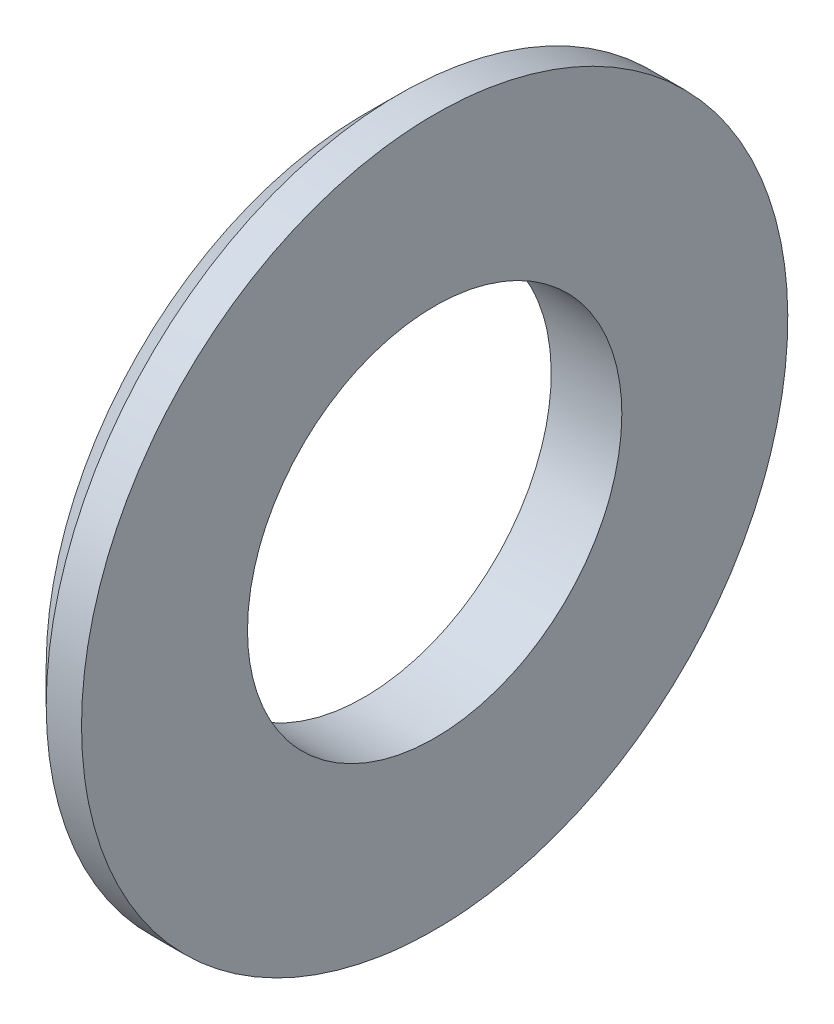
ISO-10303-21;
HEADER;
FILE_DESCRIPTION(('STEP AP214'),'2;1');
FILE_NAME('part.step','',(''),(''),'','','');
FILE_SCHEMA(('AUTOMOTIVE_DESIGN { 1 0 10303 214 1 1 1 1 }'));
ENDSEC;
DATA;
#1=APPLICATION_CONTEXT('core data for automotive mechanical design processes');
#2=APPLICATION_PROTOCOL_DEFINITION('international standard','automotive_design',2000,#1);
#3=PRODUCT_CONTEXT('',#1,'mechanical');
#4=PRODUCT('Part','Part','',(#3));
#5=PRODUCT_RELATED_PRODUCT_CATEGORY('part','',(#4));
#6=PRODUCT_DEFINITION_FORMATION('','',#4);
#7=PRODUCT_DEFINITION_CONTEXT('part definition',#1,'design');
#8=PRODUCT_DEFINITION('design','',#6,#7);
#9=PRODUCT_DEFINITION_SHAPE('','',#8);
#10=(LENGTH_UNIT() NAMED_UNIT(*) SI_UNIT(.MILLI.,.METRE.));
#11=(NAMED_UNIT(*) PLANE_ANGLE_UNIT() SI_UNIT($,.RADIAN.));
#12=(NAMED_UNIT(*) SI_UNIT($,.STERADIAN.) SOLID_ANGLE_UNIT());
#13=UNCERTAINTY_MEASURE_WITH_UNIT(LENGTH_MEASURE(1.E-05),#10,'distance_accuracy_value','');
#14=(GEOMETRIC_REPRESENTATION_CONTEXT(3) GLOBAL_UNCERTAINTY_ASSIGNED_CONTEXT((#13)) GLOBAL_UNIT_ASSIGNED_CONTEXT((#10,
#11,#12)) REPRESENTATION_CONTEXT('',''));
#15=CARTESIAN_POINT('',(0.,0.,0.));
#16=DIRECTION('',(0.,0.,1.));
#17=DIRECTION('',(1.,0.,0.));
#18=AXIS2_PLACEMENT_3D('',#15,#16,#17);
#19=CARTESIAN_POINT('',(0.,0.,4.5));
#20=CARTESIAN_POINT('',(0.5,0.,5.));
#21=(BOUNDED_CURVE() B_SPLINE_CURVE(1,(#19,#20),.UNSPECIFIED.,.F.,
.F.) B_SPLINE_CURVE_WITH_KNOTS((2,2),(0.,1.),
.UNSPECIFIED.) CURVE() GEOMETRIC_REPRESENTATION_ITEM() RATIONAL_B_SPLINE_CURVE((1.,1.)) REPRESENTATION_ITEM(''));
#22=CARTESIAN_POINT('',(-999.5,0.,0.));
#23=DIRECTION('',(1.,0.,0.));
#24=AXIS1_PLACEMENT('',#22,#23);
#25=SURFACE_OF_REVOLUTION('',#21,#24);
#26=CARTESIAN_POINT('',(0.499999999999945,0.,0.));
#27=DIRECTION('',(-1.,0.,0.));
#28=DIRECTION('',(0.,0.,1.));
#29=AXIS2_PLACEMENT_3D('',#26,#27,#28);
#30=CIRCLE('',#29,5.);
#31=CARTESIAN_POINT('',(0.5,0.,5.));
#32=VERTEX_POINT('',#31);
#33=EDGE_CURVE('E56',#32,#32,#30,.F.);
#34=ORIENTED_EDGE('',*,*,#33,.F.);
#35=EDGE_LOOP('',(#34));
#36=FACE_BOUND('',#35,.T.);
#37=CARTESIAN_POINT('',(0.,0.,0.));
#38=DIRECTION('',(-1.,0.,0.));
#39=DIRECTION('',(0.,0.,1.));
#40=AXIS2_PLACEMENT_3D('',#37,#38,#39);
#41=CIRCLE('',#40,4.5);
#42=CARTESIAN_POINT('',(0.,0.,4.5));
#43=VERTEX_POINT('',#42);
#44=EDGE_CURVE('E109',#43,#43,#41,.F.);
#45=ORIENTED_EDGE('',*,*,#44,.T.);
#46=EDGE_LOOP('',(#45));
#47=FACE_BOUND('',#46,.T.);
#48=ADVANCED_FACE('F51',(#36,#47),#25,.T.);
#49=CARTESIAN_POINT('',(0.5,0.,5.));
#50=CARTESIAN_POINT('',(1.,0.,5.));
#51=(BOUNDED_CURVE() B_SPLINE_CURVE(1,(#49,#50),.UNSPECIFIED.,.F.,
.F.) B_SPLINE_CURVE_WITH_KNOTS((2,2),(0.,1.),
.UNSPECIFIED.) CURVE() GEOMETRIC_REPRESENTATION_ITEM() RATIONAL_B_SPLINE_CURVE((1.,1.)) REPRESENTATION_ITEM(''));
#52=CARTESIAN_POINT('',(0.,0.,0.));
#53=DIRECTION('',(1.,0.,0.));
#54=AXIS1_PLACEMENT('',#52,#53);
#55=SURFACE_OF_REVOLUTION('',#51,#54);
#56=ORIENTED_EDGE('',*,*,#33,.T.);
#57=EDGE_LOOP('',(#56));
#58=FACE_BOUND('',#57,.T.);
#59=CARTESIAN_POINT('',(1.,-2.99308470301544E-10,5.));
#60=CARTESIAN_POINT('',(1.,-0.167758032825387,5.00000154802979));
#61=CARTESIAN_POINT('',(1.,-0.335493867137679,4.99155243066248));
#62=CARTESIAN_POINT('',(1.,-0.669391381789563,4.95782974268536));
#63=CARTESIAN_POINT('',(1.,-0.835552036829226,4.93254588724304));
#64=CARTESIAN_POINT('',(1.,-1.13764028737066,4.87088494986219));
#65=CARTESIAN_POINT('',(1.,-1.27408076216968,4.83698814317178));
#66=CARTESIAN_POINT('',(1.,-1.54367137821893,4.757816329775));
#67=CARTESIAN_POINT('',(1.,-1.6768205465427,4.71253800178656));
#68=CARTESIAN_POINT('',(1.,-1.93893765064654,4.61088908676401));
#69=CARTESIAN_POINT('',(1.,-2.06790209940762,4.554509512479));
#70=CARTESIAN_POINT('',(1.,-2.32066772389441,4.43105974651471));
#71=CARTESIAN_POINT('',(1.,-2.44446699179028,4.36398564800883));
#72=CARTESIAN_POINT('',(1.,-2.68587141401513,4.21969816808329));
#73=CARTESIAN_POINT('',(1.,-2.8034815327053,4.14249309197657));
#74=CARTESIAN_POINT('',(1.,-3.03182243680874,3.97841988539107));
#75=CARTESIAN_POINT('',(1.,-3.14255066966786,3.89154820242413));
#76=CARTESIAN_POINT('',(1.,-3.3562269830061,3.70883922378637));
#77=CARTESIAN_POINT('',(1.,-3.45917980361187,3.61300747151676));
#78=CARTESIAN_POINT('',(1.,-3.65668560110553,3.41297712458219));
#79=CARTESIAN_POINT('',(1.,-3.75123546389827,3.30877545507762));
#80=CARTESIAN_POINT('',(1.,-3.93119624315384,3.09280583925249));
#81=CARTESIAN_POINT('',(1.,-4.01660959363466,2.98103992110952));
#82=CARTESIAN_POINT('',(1.,-4.17774910369644,2.75066885920708));
#83=CARTESIAN_POINT('',(1.,-4.25347167455989,2.6320612052493));
#84=CARTESIAN_POINT('',(1.,-4.39463101299415,2.38892673620628));
#85=CARTESIAN_POINT('',(1.,-4.46007113790615,2.26440187052954));
#86=CARTESIAN_POINT('',(1.,-4.58025251774066,2.01023825538277));
#87=CARTESIAN_POINT('',(1.,-4.63498981087441,1.88059763351082));
#88=CARTESIAN_POINT('',(1.,-4.73332704440869,1.61720729374916));
#89=CARTESIAN_POINT('',(1.,-4.77693133245523,1.4834592028325));
#90=CARTESIAN_POINT('',(1.,-4.85273389831296,1.21275064904533));
#91=CARTESIAN_POINT('',(1.,-4.88492790115874,1.07578900263462));
#92=CARTESIAN_POINT('',(1.,-4.96397165042619,0.661663737250536));
#93=CARTESIAN_POINT('',(1.,-4.99339033045326,0.3809718040958));
#94=CARTESIAN_POINT('',(1.,-5.0046172843287,-0.181362849482049));
#95=CARTESIAN_POINT('',(1.,-4.98642551607755,-0.463005570745675));
#96=CARTESIAN_POINT('',(1.,-4.92397402324719,-0.879955886167007));
#97=CARTESIAN_POINT('',(1.,-4.89727235484689,-1.01809325324492));
#98=CARTESIAN_POINT('',(1.,-4.83233526183205,-1.29161141348033));
#99=CARTESIAN_POINT('',(1.,-4.79410415604719,-1.42699321861194));
#100=CARTESIAN_POINT('',(1.,-4.70635861941145,-1.69409746607234));
#101=CARTESIAN_POINT('',(1.,-4.65683986269291,-1.82581848367492));
#102=CARTESIAN_POINT('',(1.,-4.54690000061195,-2.08457440368558));
#103=CARTESIAN_POINT('',(1.,-4.48648292846403,-2.21161101880538));
#104=CARTESIAN_POINT('',(1.,-4.3551408650253,-2.46018614046577));
#105=CARTESIAN_POINT('',(1.,-4.28421226799065,-2.58172274160106));
#106=CARTESIAN_POINT('',(1.,-4.13239508063002,-2.81834399335951));
#107=CARTESIAN_POINT('',(1.,-4.05151017620756,-2.93343100884458));
#108=CARTESIAN_POINT('',(1.,-3.88030813089111,-3.15641778608208));
#109=CARTESIAN_POINT('',(1.,-3.78998809884217,-3.26431532811692));
#110=CARTESIAN_POINT('',(1.,-3.60061365020971,-3.47207879556547));
#111=CARTESIAN_POINT('',(1.,-3.50156246857072,-3.5719476696458));
#112=CARTESIAN_POINT('',(1.,-3.29534749765881,-3.7630380096989));
#113=CARTESIAN_POINT('',(1.,-3.18817953217534,-3.85425496901711));
#114=CARTESIAN_POINT('',(1.,-2.96657943962917,-4.0273021107453));
#115=CARTESIAN_POINT('',(1.,-2.85215000368759,-4.10913573944699));
#116=CARTESIAN_POINT('',(1.,-2.61672970089746,-4.26292223838351));
#117=CARTESIAN_POINT('',(1.,-2.49573472080214,-4.33486881242074));
#118=CARTESIAN_POINT('',(1.,-2.24815726096902,-4.46828339954117));
#119=CARTESIAN_POINT('',(1.,-2.12157682148357,-4.52975519959861));
#120=CARTESIAN_POINT('',(1.,-1.86373373364054,-4.6417931857738));
#121=CARTESIAN_POINT('',(1.,-1.73247296804808,-4.6923637007616));
#122=CARTESIAN_POINT('',(1.,-1.46620299991553,-4.78225882727186));
#123=CARTESIAN_POINT('',(1.,-1.33119460262864,-4.82158583447658));
#124=CARTESIAN_POINT('',(1.,-0.999436570010491,-4.90321814181991));
#125=CARTESIAN_POINT('',(1.,-0.801170962497733,-4.93949305866675));
#126=CARTESIAN_POINT('',(1.,-0.401924384471656,-4.98787122446463));
#127=CARTESIAN_POINT('',(1.,-0.200946267854761,-4.99999814565042));
#128=CARTESIAN_POINT('',(1.,0.167758031158162,-5.00000154808568));
#129=CARTESIAN_POINT('',(1.,0.335493865473081,-4.99155243077434));
#130=CARTESIAN_POINT('',(1.,0.669391380136326,-4.95782974290861));
#131=CARTESIAN_POINT('',(1.,0.835552035184721,-4.93254588752163));
#132=CARTESIAN_POINT('',(1.,1.13764028574709,-4.87088495024139));
#133=CARTESIAN_POINT('',(1.,1.27408076055748,-4.83698814359644));
#134=CARTESIAN_POINT('',(1.,1.54367137663327,-4.75781633028947));
#135=CARTESIAN_POINT('',(1.,1.6768205449722,-4.71253800234538));
#136=CARTESIAN_POINT('',(1.,1.93893764910992,-4.61088908741017));
#137=CARTESIAN_POINT('',(1.,2.06790209788972,-4.55450951316818));
#138=CARTESIAN_POINT('',(1.,2.32066772241753,-4.4310597472882));
#139=CARTESIAN_POINT('',(1.,2.44446699033568,-4.36398564882361));
#140=CARTESIAN_POINT('',(1.,2.68587141260856,-4.21969816897859));
#141=CARTESIAN_POINT('',(1.,2.80348153132445,-4.14249309291108));
#142=CARTESIAN_POINT('',(1.,3.03182243548256,-3.9784198864017));
#143=CARTESIAN_POINT('',(1.,3.14255066837063,-3.89154820347168));
#144=CARTESIAN_POINT('',(1.,3.35622698176978,-3.70883922490516));
#145=CARTESIAN_POINT('',(1.,3.4591798024075,-3.61300747266985));
#146=CARTESIAN_POINT('',(1.,3.65668559996786,-3.4129771258011));
#147=CARTESIAN_POINT('',(1.,3.75123546279534,-3.30877545632804));
#148=CARTESIAN_POINT('',(1.,3.9311962421229,-3.09280584056289));
#149=CARTESIAN_POINT('',(1.,4.01660959264098,-2.98103992244839));
#150=CARTESIAN_POINT('',(1.,4.17774910277955,-2.75066886059966));
#151=CARTESIAN_POINT('',(1.,4.25347167368253,-2.63206120666712));
#152=CARTESIAN_POINT('',(1.,4.39463101219784,-2.38892673767115));
#153=CARTESIAN_POINT('',(1.,4.46007113715135,-2.26440187201623));
#154=CARTESIAN_POINT('',(1.,4.58025251707059,-2.01023825690951));
#155=CARTESIAN_POINT('',(1.,4.63498981024755,-1.88059763505582));
#156=CARTESIAN_POINT('',(1.,4.73332704386962,-1.61720729532694));
#157=CARTESIAN_POINT('',(1.,4.77693133196075,-1.4834592044248));
#158=CARTESIAN_POINT('',(1.,4.85273389790871,-1.21275065066291));
#159=CARTESIAN_POINT('',(1.,4.88492790080015,-1.07578900426292));
#160=CARTESIAN_POINT('',(1.,4.96397165020563,-0.661663738905188));
#161=CARTESIAN_POINT('',(1.,4.99339033032627,-0.380971805760261));
#162=CARTESIAN_POINT('',(1.,5.00461728438915,0.181362847813846));
#163=CARTESIAN_POINT('',(1.,4.98642551623189,0.463005569083539));
#164=CARTESIAN_POINT('',(1.,4.92397402354051,0.879955884525689));
#165=CARTESIAN_POINT('',(1.,4.89727235518625,1.0180932516125));
#166=CARTESIAN_POINT('',(1.,4.83233526226259,1.29161141186956));
#167=CARTESIAN_POINT('',(1.,4.79410415652286,1.42699321701391));
#168=CARTESIAN_POINT('',(1.,4.70635861997615,1.69409746450354));
#169=CARTESIAN_POINT('',(1.,4.65683986330153,1.82581848212261));
#170=CARTESIAN_POINT('',(1.,4.54690000130683,2.08457440216988));
#171=CARTESIAN_POINT('',(1.,4.48648292920127,2.21161101730981));
#172=CARTESIAN_POINT('',(1.,4.3551408658454,2.46018613901399));
#173=CARTESIAN_POINT('',(1.,4.28421226885126,2.58172274017293));
#174=CARTESIAN_POINT('',(1.,4.13239508156949,2.81834399198202));
#175=CARTESIAN_POINT('',(1.,4.05151017718538,2.93343100749406));
#176=CARTESIAN_POINT('',(1.,3.88030813194319,3.15641778478873));
#177=CARTESIAN_POINT('',(1.,3.78998809993015,3.26431532685374));
#178=CARTESIAN_POINT('',(1.,3.6006136513668,3.47207879436556));
#179=CARTESIAN_POINT('',(1.,3.50156246976101,3.57194766847896));
#180=CARTESIAN_POINT('',(1.,3.29534749891278,3.76303800860077));
#181=CARTESIAN_POINT('',(1.,3.18817953345978,3.85425496795464));
#182=CARTESIAN_POINT('',(1.,2.96657944097144,4.02730210975656));
#183=CARTESIAN_POINT('',(1.,2.85215000505722,4.10913573849633));
#184=CARTESIAN_POINT('',(1.,2.61672970231883,4.26292223751101));
#185=CARTESIAN_POINT('',(1.,2.4957347222479,4.33486881158835));
#186=CARTESIAN_POINT('',(1.,2.24815726246011,4.46828339879093));
#187=CARTESIAN_POINT('',(1.,2.12157682299561,4.52975519889042));
#188=CARTESIAN_POINT('',(1.,1.86373373519004,4.64179318515166));
#189=CARTESIAN_POINT('',(1.,1.73247296961409,4.69236370018341));
#190=CARTESIAN_POINT('',(1.,1.46620300151073,4.78225882678281));
#191=CARTESIAN_POINT('',(1.,1.33119460423653,4.8215858340327));
#192=CARTESIAN_POINT('',(1.,0.999436571105496,4.90321814161946));
#193=CARTESIAN_POINT('',(1.,0.801170963048538,4.93949305860007));
#194=CARTESIAN_POINT('',(1.,0.401924383918908,4.98787122453155));
#195=CARTESIAN_POINT('',(1.,0.200946266742681,4.99999814571736));
#196=CARTESIAN_POINT('',(1.,-2.99308470301544E-10,5.));
#197=B_SPLINE_CURVE_WITH_KNOTS('',3,(#59,#60,#61,#62,#63,#64,#65,#66,#67,#68,#69,#70,#71,#72,
#73,#74,#75,#76,#77,#78,#79,#80,#81,#82,#83,#84,#85,#86,#87,#88,#89,#90,#91,#92,#93,#94,#95,#96,
#97,#98,#99,#100,#101,#102,#103,#104,#105,#106,#107,#108,#109,#110,#111,#112,#113,#114,#115,
#116,#117,#118,#119,#120,#121,#122,#123,#124,#125,#126,#127,#128,#129,#130,#131,#132,#133,#134,
#135,#136,#137,#138,#139,#140,#141,#142,#143,#144,#145,#146,#147,#148,#149,#150,#151,#152,#153,
#154,#155,#156,#157,#158,#159,#160,#161,#162,#163,#164,#165,#166,#167,#168,#169,#170,#171,#172,
#173,#174,#175,#176,#177,#178,#179,#180,#181,#182,#183,#184,#185,#186,#187,#188,#189,#190,#191,
#192,#193,#194,#195,#196),.UNSPECIFIED.,.T.,.F.,(4,2,2,2,2,2,2,2,2,2,2,2,2,2,2,2,2,2,2,2,2,2,2,
2,2,2,2,2,2,2,2,2,2,2,2,2,2,2,2,2,2,2,2,2,2,2,2,2,2,2,2,2,2,2,2,2,2,2,2,2,2,2,2,2,2,2,2,2,4),
(0.,0.503028424610895,1.00636444627927,1.42764855986454,1.84905575286752,2.27080551824605,
2.69270970791953,3.11427015909089,3.53598604904621,3.95744273747951,4.37905497001639,
4.8005546014842,5.22220987499996,5.64372718566218,6.06540023213516,6.48690835468098,
6.90857423249018,7.75099585816318,8.59341822874699,9.01508373374531,9.43659148219846,
9.85826104124517,10.2797748691019,10.7014336239815,11.1229367443177,11.544569404554,
11.9660464986957,12.3877419420515,12.8092820064289,13.2310892809016,13.6527437331661,
14.0742304379128,14.4956272683898,15.0987633372328,15.7013078612753,16.2043362858851,
16.7076723075545,17.12895642114,17.5503636141432,17.9721133795215,18.3940175691948,
18.8155780203661,19.2372939103214,19.6587505987547,20.0803628312917,20.5018624627595,
20.9235177362752,21.3450350469374,21.7667080934104,22.1882162159562,22.6098820937655,
23.4523037194384,24.2947260900223,24.7163915950206,25.1378993434737,25.5595689025204,
25.981082730377,26.4027414852567,26.8242446055929,27.2458772658296,27.6673543599716,
28.089049803327,28.5105898677042,28.9323971421754,29.3540515944386,29.7755382991864,
30.1969351296651,30.8000712001731,31.4026157258778),.UNSPECIFIED.);
#198=CARTESIAN_POINT('',(1.,-2.99308470301544E-10,5.));
#199=VERTEX_POINT('',#198);
#200=EDGE_CURVE('E65',#199,#199,#197,.T.);
#201=ORIENTED_EDGE('',*,*,#200,.F.);
#202=EDGE_LOOP('',(#201));
#203=FACE_BOUND('',#202,.T.);
#204=ADVANCED_FACE('F86',(#58,#203),#55,.T.);
#205=CARTESIAN_POINT('',(0.,-4.554,4.554));
#206=DIRECTION('',(-1.,0.,0.));
#207=DIRECTION('',(0.,0.,-1.));
#208=AXIS2_PLACEMENT_3D('',#205,#206,#207);
#209=PLANE('',#208);
#210=CARTESIAN_POINT('',(0.,-1.58633489259819E-10,2.65));
#211=CARTESIAN_POINT('',(0.,-0.0744036897546171,2.64999955411855));
#212=CARTESIAN_POINT('',(0.,-0.148821053038145,2.64686366502387));
#213=CARTESIAN_POINT('',(0.,-0.297141510098404,2.63434049635336));
#214=CARTESIAN_POINT('',(0.,-0.371044445535923,2.62495137117123));
#215=CARTESIAN_POINT('',(0.,-0.517921052661863,2.59996397233258));
#216=CARTESIAN_POINT('',(0.,-0.590893058572626,2.58435584236101));
#217=CARTESIAN_POINT('',(0.,-0.735303386108935,2.54703802343968));
#218=CARTESIAN_POINT('',(0.,-0.806740412289601,2.5253233830353));
#219=CARTESIAN_POINT('',(0.,-1.01767791920745,2.45131991290642));
#220=CARTESIAN_POINT('',(0.,-1.15415981832655,2.39011074898915));
#221=CARTESIAN_POINT('',(0.,-1.41489510667138,2.24561538532905));
#222=CARTESIAN_POINT('',(0.,-1.53914803079326,2.16232834634437));
#223=CARTESIAN_POINT('',(0.,-1.713656104678,2.02273550545209));
#224=CARTESIAN_POINT('',(0.,-1.76987978376217,1.97372398968708));
#225=CARTESIAN_POINT('',(0.,-1.87795970738275,1.87117744780052));
#226=CARTESIAN_POINT('',(0.,-1.9298201105191,1.81764682858471));
#227=CARTESIAN_POINT('',(0.,-2.02886968902779,1.70638141643303));
#228=CARTESIAN_POINT('',(0.,-2.07605673773129,1.64864473002628));
#229=CARTESIAN_POINT('',(0.,-2.16540397669068,1.52940671888835));
#230=CARTESIAN_POINT('',(0.,-2.207563000138,1.46790452532156));
#231=CARTESIAN_POINT('',(0.,-2.32599936186899,1.27842029958709));
#232=CARTESIAN_POINT('',(0.,-2.39434047451514,1.14534303628278));
#233=CARTESIAN_POINT('',(0.,-2.50766931295167,0.869675584696486));
#234=CARTESIAN_POINT('',(0.,-2.55265728816447,0.727085498034255));
#235=CARTESIAN_POINT('',(0.,-2.61806793371742,0.436357959836654));
#236=CARTESIAN_POINT('',(0.,-2.63849047286773,0.288220478680201));
#237=CARTESIAN_POINT('',(0.,-2.65416936702249,-0.00938034668104604));
#238=CARTESIAN_POINT('',(0.,-2.64942572202694,-0.158843690885839));
#239=CARTESIAN_POINT('',(0.,-2.61492595100105,-0.454834940447797));
#240=CARTESIAN_POINT('',(0.,-2.58516995854679,-0.601362861477037));
#241=CARTESIAN_POINT('',(0.,-2.50143479712681,-0.887412493931662));
#242=CARTESIAN_POINT('',(0.,-2.44745536944154,-1.0269341305084));
#243=CARTESIAN_POINT('',(0.,-2.34958508772754,-1.22781432251223));
#244=CARTESIAN_POINT('',(0.,-2.3141219165482,-1.29340598784758));
#245=CARTESIAN_POINT('',(0.,-2.23779846390891,-1.42137224506807));
#246=CARTESIAN_POINT('',(0.,-2.19693943409281,-1.48374757837432));
#247=CARTESIAN_POINT('',(0.,-2.11012961665562,-1.6048048645679));
#248=CARTESIAN_POINT('',(0.,-2.0641811428905,-1.66348847698012));
#249=CARTESIAN_POINT('',(0.,-1.96747481907307,-1.77682404102086));
#250=CARTESIAN_POINT('',(0.,-1.91671237037817,-1.83147204711293));
#251=CARTESIAN_POINT('',(0.,-1.75783834903484,-1.98862889367565));
#252=CARTESIAN_POINT('',(0.,-1.64302482684356,-2.08451098344069));
#253=CARTESIAN_POINT('',(0.,-1.39891607912493,-2.25560370682414));
#254=CARTESIAN_POINT('',(0.,-1.26962140431164,-2.33081512616674));
#255=CARTESIAN_POINT('',(0.,-1.06762768790985,-2.42657359289479));
#256=CARTESIAN_POINT('',(0.,-0.998867838991715,-2.45567440893512));
#257=CARTESIAN_POINT('',(0.,-0.859178196792865,-2.50795983874755));
#258=CARTESIAN_POINT('',(0.,-0.788250212069381,-2.53114924044205));
#259=CARTESIAN_POINT('',(0.,-0.644812300261574,-2.57143165940846));
#260=CARTESIAN_POINT('',(0.,-0.572305065404993,-2.58853430339692));
#261=CARTESIAN_POINT('',(0.,-0.426121593210162,-2.61657320838744));
#262=CARTESIAN_POINT('',(0.,-0.352445707265283,-2.62751128814089));
#263=CARTESIAN_POINT('',(0.,-0.232213024964345,-2.64021603025719));
#264=CARTESIAN_POINT('',(0.,-0.185848729638136,-2.64388385782696));
#265=CARTESIAN_POINT('',(0.,-0.0929914032431338,-2.64877598201678));
#266=CARTESIAN_POINT('',(0.,-0.0464983721743419,-2.65000027863683));
#267=CARTESIAN_POINT('',(0.,0.0744036888709325,-2.64999955414335));
#268=CARTESIAN_POINT('',(0.,0.148821052155299,-2.6468636650735));
#269=CARTESIAN_POINT('',(0.,0.29714150921937,-2.63434049645251));
#270=CARTESIAN_POINT('',(0.,0.371044444659861,-2.62495137129506));
#271=CARTESIAN_POINT('',(0.,0.517921051794209,-2.59996397250542));
#272=CARTESIAN_POINT('',(0.,0.590893057710405,-2.58435584255816));
#273=CARTESIAN_POINT('',(0.,0.735303385259564,-2.54703802368489));
#274=CARTESIAN_POINT('',(0.,0.806740411447651,-2.52532338330427));
#275=CARTESIAN_POINT('',(0.,1.01767791839034,-2.45131991324565));
#276=CARTESIAN_POINT('',(0.,1.15415981752984,-2.39011074937388));
#277=CARTESIAN_POINT('',(0.,1.41489510592283,-2.24561538580069));
#278=CARTESIAN_POINT('',(0.,1.53914803007248,-2.16232834685742));
#279=CARTESIAN_POINT('',(0.,1.71365610400375,-2.02273550602331));
#280=CARTESIAN_POINT('',(0.,1.76987978310425,-1.97372399027705));
#281=CARTESIAN_POINT('',(0.,1.87795970675899,-1.87117744842654));
#282=CARTESIAN_POINT('',(0.,1.92982010991318,-1.81764682922802));
#283=CARTESIAN_POINT('',(0.,2.02886968845896,-1.70638141710936));
#284=CARTESIAN_POINT('',(0.,2.07605673718172,-1.64864473071833));
#285=CARTESIAN_POINT('',(0.,2.16540397618087,-1.52940671961017));
#286=CARTESIAN_POINT('',(0.,2.20756299964869,-1.46790452605742));
#287=CARTESIAN_POINT('',(0.,2.32599936144285,-1.27842030036242));
#288=CARTESIAN_POINT('',(0.,2.39434047413337,-1.14534303708089));
#289=CARTESIAN_POINT('',(0.,2.50766931266178,-0.869675585532364));
#290=CARTESIAN_POINT('',(0.,2.55265728792211,-0.727085498885133));
#291=CARTESIAN_POINT('',(0.,2.61806793357197,-0.436357960709341));
#292=CARTESIAN_POINT('',(0.,2.63849047277165,-0.288220479559696));
#293=CARTESIAN_POINT('',(0.,2.65416936702561,0.00938034579632508));
#294=CARTESIAN_POINT('',(0.,2.64942572207989,0.1588436900027));
#295=CARTESIAN_POINT('',(0.,2.61492595115266,0.454834939576164));
#296=CARTESIAN_POINT('',(0.,2.58516995874724,0.601362860615326));
#297=CARTESIAN_POINT('',(0.,2.50143479742261,0.887412493097863));
#298=CARTESIAN_POINT('',(0.,2.44745536978385,1.02693412969259));
#299=CARTESIAN_POINT('',(0.,2.34958508813681,1.22781432172902));
#300=CARTESIAN_POINT('',(0.,2.31412191697934,1.29340598707618));
#301=CARTESIAN_POINT('',(0.,2.23779846438273,1.4213722443221));
#302=CARTESIAN_POINT('',(0.,2.19693943458742,1.48374757764196));
#303=CARTESIAN_POINT('',(0.,2.11012961719059,1.60480486386448));
#304=CARTESIAN_POINT('',(0.,2.06418114344503,1.66348847629203));
#305=CARTESIAN_POINT('',(0.,1.96747481966536,1.77682404036502));
#306=CARTESIAN_POINT('',(0.,1.91671237098866,1.83147204647402));
#307=CARTESIAN_POINT('',(0.,1.75783834969772,1.9886288930897));
#308=CARTESIAN_POINT('',(0.,1.64302482753841,2.084510982893));
#309=CARTESIAN_POINT('',(0.,1.39891607987682,2.25560370635783));
#310=CARTESIAN_POINT('',(0.,1.26962140508858,2.33081512574353));
#311=CARTESIAN_POINT('',(0.,1.06762768871887,2.42657359253884));
#312=CARTESIAN_POINT('',(0.,0.998867839810619,2.45567440860202));
#313=CARTESIAN_POINT('',(0.,0.859178197629598,2.50795983846089));
#314=CARTESIAN_POINT('',(0.,0.78825021291407,2.53114924017899));
#315=CARTESIAN_POINT('',(0.,0.644812301119774,2.57143165919326));
#316=CARTESIAN_POINT('',(0.,0.572305066268743,2.58853430320596));
#317=CARTESIAN_POINT('',(0.,0.426121594082905,2.61657320824532));
#318=CARTESIAN_POINT('',(0.,0.352445708141469,2.62751128802338));
#319=CARTESIAN_POINT('',(0.,0.232213025551594,2.64021603021073));
#320=CARTESIAN_POINT('',(0.,0.185848729932167,2.64388385781147));
#321=CARTESIAN_POINT('',(0.,0.0929914029491004,2.64877598203227));
#322=CARTESIAN_POINT('',(0.,0.0464983715854602,2.65000027865233));
#323=CARTESIAN_POINT('',(0.,-1.58633489259819E-10,2.65));
#324=B_SPLINE_CURVE_WITH_KNOTS('',3,(#210,#211,#212,#213,#214,#215,#216,#217,#218,#219,#220,
#221,#222,#223,#224,#225,#226,#227,#228,#229,#230,#231,#232,#233,#234,#235,#236,#237,#238,#239,
#240,#241,#242,#243,#244,#245,#246,#247,#248,#249,#250,#251,#252,#253,#254,#255,#256,#257,#258,
#259,#260,#261,#262,#263,#264,#265,#266,#267,#268,#269,#270,#271,#272,#273,#274,#275,#276,#277,
#278,#279,#280,#281,#282,#283,#284,#285,#286,#287,#288,#289,#290,#291,#292,#293,#294,#295,#296,
#297,#298,#299,#300,#301,#302,#303,#304,#305,#306,#307,#308,#309,#310,#311,#312,#313,#314,#315,
#316,#317,#318,#319,#320,#321,#322,#323),.UNSPECIFIED.,.T.,.F.,(4,2,2,2,2,2,2,2,2,2,2,2,2,2,2,2,
2,2,2,2,2,2,2,2,2,2,2,2,2,2,2,2,2,2,2,2,2,2,2,2,2,2,2,2,2,2,2,2,2,2,2,2,2,2,2,2,4),(0.,
0.22316826262968,0.446402421281883,0.669991793395994,0.893762987961423,1.34023868624527,
1.78673135875491,2.01027023111086,2.23359357832544,2.45701808914353,2.680494347606,
3.12698091739496,3.57346271840055,4.01994690379787,4.46643108919519,4.91291289020077,
5.35939945998975,5.58287571845225,5.80630022927038,6.02962357648492,6.25316244884083,
6.6996551213505,7.14613081963432,7.36990201420032,7.5934913863151,7.81672554496687,
8.03989380759574,8.17936217035954,8.31883053312335,8.54199879575222,8.765232954404,
8.98882232651878,9.21259352108477,9.6590692193686,10.1055618918783,10.3291007642342,
10.5524241114487,10.7758486222668,10.9993248807294,11.4458114505183,11.8922932515239,
12.3387774369212,12.7852616223186,13.2317434233241,13.6782299931131,13.9017062515756,
14.1251307623937,14.3484541096082,14.5719929819642,15.0184856544738,15.4649613527577,
15.6887325473231,15.9123219194372,16.1355560780894,16.3587243407191,16.4981927043659,
16.6376610680128),.UNSPECIFIED.);
#325=CARTESIAN_POINT('',(0.,-1.58633489259819E-10,2.65));
#326=VERTEX_POINT('',#325);
#327=EDGE_CURVE('E60',#326,#326,#324,.T.);
#328=ORIENTED_EDGE('',*,*,#327,.T.);
#329=EDGE_LOOP('',(#328));
#330=FACE_BOUND('',#329,.T.);
#331=ORIENTED_EDGE('',*,*,#44,.F.);
#332=EDGE_LOOP('',(#331));
#333=FACE_BOUND('',#332,.T.);
#334=ADVANCED_FACE('F103',(#330,#333),#209,.T.);
#335=CARTESIAN_POINT('',(1.,-5.06,5.06));
#336=DIRECTION('',(-1.,0.,0.));
#337=DIRECTION('',(0.,0.,-1.));
#338=AXIS2_PLACEMENT_3D('',#335,#336,#337);
#339=PLANE('',#338);
#340=CARTESIAN_POINT('',(1.,-7.24699064855838E-10,-2.65));
#341=CARTESIAN_POINT('',(1.,-0.0744036903206828,-2.64999955410265));
#342=CARTESIAN_POINT('',(1.,-0.148821053603541,-2.64686366499208));
#343=CARTESIAN_POINT('',(1.,-0.297141510661126,-2.63434049628989));
#344=CARTESIAN_POINT('',(1.,-0.371044446096638,-2.62495137109197));
#345=CARTESIAN_POINT('',(1.,-0.517921053217242,-2.59996397222194));
#346=CARTESIAN_POINT('',(1.,-0.590893059124671,-2.58435584223479));
#347=CARTESIAN_POINT('',(1.,-0.735303386653009,-2.54703802328261));
#348=CARTESIAN_POINT('',(1.,-0.806740412829036,-2.52532338286297));
#349=CARTESIAN_POINT('',(1.,-1.01767791973108,-2.45131991268903));
#350=CARTESIAN_POINT('',(1.,-1.15415981883711,-2.39011074874261));
#351=CARTESIAN_POINT('',(1.,-1.41489510715107,-2.24561538502682));
#352=CARTESIAN_POINT('',(1.,-1.53914803125516,-2.16232834601559));
#353=CARTESIAN_POINT('',(1.,-1.71365610511008,-2.02273550508604));
#354=CARTESIAN_POINT('',(1.,-1.76987978418378,-1.97372398930902));
#355=CARTESIAN_POINT('',(1.,-1.87795970778245,-1.87117744739937));
#356=CARTESIAN_POINT('',(1.,-1.92982011090737,-1.81764682817248));
#357=CARTESIAN_POINT('',(1.,-2.02886968939229,-1.70638141599964));
#358=CARTESIAN_POINT('',(1.,-2.07605673808346,-1.64864472958281));
#359=CARTESIAN_POINT('',(1.,-2.16540397701738,-1.5294067184258));
#360=CARTESIAN_POINT('',(1.,-2.20756300045155,-1.46790452485));
#361=CARTESIAN_POINT('',(1.,-2.32599936214207,-1.27842029909024));
#362=CARTESIAN_POINT('',(1.,-2.3943404747598,-1.14534303577133));
#363=CARTESIAN_POINT('',(1.,-2.50766931313744,-0.869675584160822));
#364=CARTESIAN_POINT('',(1.,-2.55265728831978,-0.72708549748898));
#365=CARTESIAN_POINT('',(1.,-2.61806793381063,-0.436357959277406));
#366=CARTESIAN_POINT('',(1.,-2.63849047292929,-0.28822047811659));
#367=CARTESIAN_POINT('',(1.,-2.65416936702048,0.00938034724800587));
#368=CARTESIAN_POINT('',(1.,-2.64942572199301,0.158843691451785));
#369=CARTESIAN_POINT('',(1.,-2.61492595090389,0.454834941006374));
#370=CARTESIAN_POINT('',(1.,-2.58516995841833,0.601362862029257));
#371=CARTESIAN_POINT('',(1.,-2.50143479693725,0.887412494465995));
#372=CARTESIAN_POINT('',(1.,-2.44745536922218,1.0269341310312));
#373=CARTESIAN_POINT('',(1.,-2.34958508746527,1.22781432301412));
#374=CARTESIAN_POINT('',(1.,-2.31412191627191,1.2934059883419));
#375=CARTESIAN_POINT('',(1.,-2.23779846360529,1.42137224554609));
#376=CARTESIAN_POINT('',(1.,-2.19693943377587,1.48374757884361));
#377=CARTESIAN_POINT('',(1.,-2.11012961631282,1.60480486501865));
#378=CARTESIAN_POINT('',(1.,-2.06418114253516,1.66348847742105));
#379=CARTESIAN_POINT('',(1.,-1.96747481869352,1.77682404144113));
#380=CARTESIAN_POINT('',(1.,-1.91671236998695,1.83147204752236));
#381=CARTESIAN_POINT('',(1.,-1.75783834861004,1.98862889405114));
#382=CARTESIAN_POINT('',(1.,-1.64302482639829,2.08451098379165));
#383=CARTESIAN_POINT('',(1.,-1.39891607864311,2.25560370712296));
#384=CARTESIAN_POINT('',(1.,-1.26962140381375,2.33081512643795));
#385=CARTESIAN_POINT('',(1.,-1.0676276873915,2.42657359312285));
#386=CARTESIAN_POINT('',(1.,-0.998867838467158,2.45567440914849));
#387=CARTESIAN_POINT('',(1.,-0.859178196257138,2.50795983893107));
#388=CARTESIAN_POINT('',(1.,-0.788250211528701,2.53114924061043));
#389=CARTESIAN_POINT('',(1.,-0.644812299712289,2.5714316595462));
#390=CARTESIAN_POINT('',(1.,-0.572305064852056,2.58853430351918));
#391=CARTESIAN_POINT('',(1.,-0.426121592651234,2.61657320847847));
#392=CARTESIAN_POINT('',(1.,-0.352445706704019,2.62751128821618));
#393=CARTESIAN_POINT('',(1.,-0.232213024400368,2.6402160303068));
#394=CARTESIAN_POINT('',(1.,-0.185848729073375,2.64388385786666));
#395=CARTESIAN_POINT('',(1.,-0.092991402677329,2.64877598203664));
#396=CARTESIAN_POINT('',(1.,-0.0464983716082758,2.65000027864676));
#397=CARTESIAN_POINT('',(1.,0.074403689436998,2.64999955412745));
#398=CARTESIAN_POINT('',(1.,0.148821052720694,2.64686366504171));
#399=CARTESIAN_POINT('',(1.,0.297141509782091,2.63434049638904));
#400=CARTESIAN_POINT('',(1.,0.371044445220576,2.6249513712158));
#401=CARTESIAN_POINT('',(1.,0.517921052349587,2.59996397239479));
#402=CARTESIAN_POINT('',(1.,0.590893058262448,2.58435584243194));
#403=CARTESIAN_POINT('',(1.,0.735303385803637,2.54703802352782));
#404=CARTESIAN_POINT('',(1.,0.806740411987085,2.52532338313195));
#405=CARTESIAN_POINT('',(1.,1.01767791891397,2.45131991302826));
#406=CARTESIAN_POINT('',(1.,1.15415981804039,2.39011074912734));
#407=CARTESIAN_POINT('',(1.,1.41489510640252,2.24561538549846));
#408=CARTESIAN_POINT('',(1.,1.53914803053438,2.16232834652865));
#409=CARTESIAN_POINT('',(1.,1.71365610443583,2.02273550565726));
#410=CARTESIAN_POINT('',(1.,1.76987978352586,1.97372398989899));
#411=CARTESIAN_POINT('',(1.,1.8779597071587,1.87117744802539));
#412=CARTESIAN_POINT('',(1.,1.92982011030145,1.81764682881579));
#413=CARTESIAN_POINT('',(1.,2.02886968882346,1.70638141667597));
#414=CARTESIAN_POINT('',(1.,2.07605673753388,1.64864473027487));
#415=CARTESIAN_POINT('',(1.,2.16540397650757,1.52940671914762));
#416=CARTESIAN_POINT('',(1.,2.20756299996225,1.46790452558586));
#417=CARTESIAN_POINT('',(1.,2.32599936171593,1.27842029986556));
#418=CARTESIAN_POINT('',(1.,2.39434047437802,1.14534303656943));
#419=CARTESIAN_POINT('',(1.,2.50766931284755,0.869675584996702));
#420=CARTESIAN_POINT('',(1.,2.55265728807742,0.72708549833986));
#421=CARTESIAN_POINT('',(1.,2.61806793366518,0.436357960150095));
#422=CARTESIAN_POINT('',(1.,2.63849047283322,0.288220478996088));
#423=CARTESIAN_POINT('',(1.,2.65416936702361,-0.0093803463632818));
#424=CARTESIAN_POINT('',(1.,2.64942572204596,-0.158843690568644));
#425=CARTESIAN_POINT('',(1.,2.6149259510555,-0.454834940134738));
#426=CARTESIAN_POINT('',(1.,2.58516995861879,-0.601362861167544));
#427=CARTESIAN_POINT('',(1.,2.50143479723305,-0.887412493632194));
#428=CARTESIAN_POINT('',(1.,2.44745536956449,-1.02693413021539));
#429=CARTESIAN_POINT('',(1.,2.34958508787454,-1.22781432223092));
#430=CARTESIAN_POINT('',(1.,2.31412191670306,-1.2934059875705));
#431=CARTESIAN_POINT('',(1.,2.23779846407911,-1.42137224480011));
#432=CARTESIAN_POINT('',(1.,2.19693943427048,-1.48374757811125));
#433=CARTESIAN_POINT('',(1.,2.11012961684779,-1.60480486431523));
#434=CARTESIAN_POINT('',(1.,2.06418114308969,-1.66348847673296));
#435=CARTESIAN_POINT('',(1.,1.96747481928581,-1.77682404078529));
#436=CARTESIAN_POINT('',(1.,1.91671237059744,-1.83147204688345));
#437=CARTESIAN_POINT('',(1.,1.75783834927293,-1.98862889346519));
#438=CARTESIAN_POINT('',(1.,1.64302482709314,-2.08451098324397));
#439=CARTESIAN_POINT('',(1.,1.398916079395,-2.25560370665665));
#440=CARTESIAN_POINT('',(1.,1.2696214045907,-2.33081512601474));
#441=CARTESIAN_POINT('',(1.,1.06762768820053,-2.42657359276689));
#442=CARTESIAN_POINT('',(1.,0.998867839286062,-2.45567440881538));
#443=CARTESIAN_POINT('',(1.,0.859178197093872,-2.50795983864442));
#444=CARTESIAN_POINT('',(1.,0.78825021237339,-2.53114924034737));
#445=CARTESIAN_POINT('',(1.,0.644812300570489,-2.571431659331));
#446=CARTESIAN_POINT('',(1.,0.572305065715805,-2.58853430332821));
#447=CARTESIAN_POINT('',(1.,0.426121593523977,-2.61657320833634));
#448=CARTESIAN_POINT('',(1.,0.352445707580204,-2.62751128809866));
#449=CARTESIAN_POINT('',(1.,0.232213024987616,-2.64021603026033));
#450=CARTESIAN_POINT('',(1.,0.185848729367406,-2.64388385785117));
#451=CARTESIAN_POINT('',(1.,0.0929914023832955,-2.64877598205213));
#452=CARTESIAN_POINT('',(1.,0.0464983710193941,-2.65000027866226));
#453=CARTESIAN_POINT('',(1.,-7.24699064855838E-10,-2.65));
#454=B_SPLINE_CURVE_WITH_KNOTS('',3,(#340,#341,#342,#343,#344,#345,#346,#347,#348,#349,#350,
#351,#352,#353,#354,#355,#356,#357,#358,#359,#360,#361,#362,#363,#364,#365,#366,#367,#368,#369,
#370,#371,#372,#373,#374,#375,#376,#377,#378,#379,#380,#381,#382,#383,#384,#385,#386,#387,#388,
#389,#390,#391,#392,#393,#394,#395,#396,#397,#398,#399,#400,#401,#402,#403,#404,#405,#406,#407,
#408,#409,#410,#411,#412,#413,#414,#415,#416,#417,#418,#419,#420,#421,#422,#423,#424,#425,#426,
#427,#428,#429,#430,#431,#432,#433,#434,#435,#436,#437,#438,#439,#440,#441,#442,#443,#444,#445,
#446,#447,#448,#449,#450,#451,#452,#453),.UNSPECIFIED.,.T.,.F.,(4,2,2,2,2,2,2,2,2,2,2,2,2,2,2,2,
2,2,2,2,2,2,2,2,2,2,2,2,2,2,2,2,2,2,2,2,2,2,2,2,2,2,2,2,2,2,2,2,2,2,2,2,2,2,2,2,4),(0.,
0.223168262629681,0.446402421281884,0.669991793395996,0.893762987961425,1.34023868624528,
1.78673135875492,2.01027023111086,2.23359357832544,2.45701808914353,2.680494347606,
3.12698091739496,3.57346271840055,4.01994690379788,4.4664310891952,4.91291289020077,
5.35939945998975,5.58287571845225,5.80630022927038,6.02962357648492,6.25316244884083,
6.6996551213505,7.14613081963433,7.36990201420032,7.5934913863151,7.81672554496687,
8.03989380759574,8.17936217035954,8.31883053312335,8.54199879575222,8.76523295440399,
8.98882232651878,9.21259352108477,9.65906921936859,10.1055618918783,10.3291007642342,
10.5524241114487,10.7758486222668,10.9993248807293,11.4458114505183,11.8922932515239,
12.3387774369212,12.7852616223185,13.2317434233241,13.6782299931131,13.9017062515756,
14.1251307623937,14.3484541096082,14.5719929819642,15.0184856544738,15.4649613527577,
15.6887325473231,15.9123219194372,16.1355560780894,16.3587243407191,16.4981927043659,
16.6376610680128),.UNSPECIFIED.);
#455=CARTESIAN_POINT('',(1.,-7.24699064855838E-10,-2.65));
#456=VERTEX_POINT('',#455);
#457=EDGE_CURVE('E10',#456,#456,#454,.T.);
#458=ORIENTED_EDGE('',*,*,#457,.T.);
#459=EDGE_LOOP('',(#458));
#460=FACE_BOUND('',#459,.T.);
#461=ORIENTED_EDGE('',*,*,#200,.T.);
#462=EDGE_LOOP('',(#461));
#463=FACE_BOUND('',#462,.T.);
#464=ADVANCED_FACE('F53',(#460,#463),#339,.F.);
#465=CARTESIAN_POINT('',(0.,0.,2.65));
#466=CARTESIAN_POINT('',(1.,0.,2.65));
#467=(BOUNDED_CURVE() B_SPLINE_CURVE(1,(#465,#466),.UNSPECIFIED.,.F.,
.F.) B_SPLINE_CURVE_WITH_KNOTS((2,2),(0.,1.),
.UNSPECIFIED.) CURVE() GEOMETRIC_REPRESENTATION_ITEM() RATIONAL_B_SPLINE_CURVE((1.,1.)) REPRESENTATION_ITEM(''));
#468=CARTESIAN_POINT('',(0.,0.,0.));
#469=DIRECTION('',(1.,0.,0.));
#470=AXIS1_PLACEMENT('',#468,#469);
#471=SURFACE_OF_REVOLUTION('',#467,#470);
#472=ORIENTED_EDGE('',*,*,#327,.F.);
#473=EDGE_LOOP('',(#472));
#474=FACE_BOUND('',#473,.T.);
#475=ORIENTED_EDGE('',*,*,#457,.F.);
#476=EDGE_LOOP('',(#475));
#477=FACE_BOUND('',#476,.T.);
#478=ADVANCED_FACE('F80',(#474,#477),#471,.F.);
#479=CLOSED_SHELL('',(#48,#204,#334,#464,#478));
#480=MANIFOLD_SOLID_BREP('B2',#479);
#481=ADVANCED_BREP_SHAPE_REPRESENTATION('',(#18,#480),#14);
#482=SHAPE_DEFINITION_REPRESENTATION(#9,#481);
ENDSEC;
END-ISO-10303-21;
